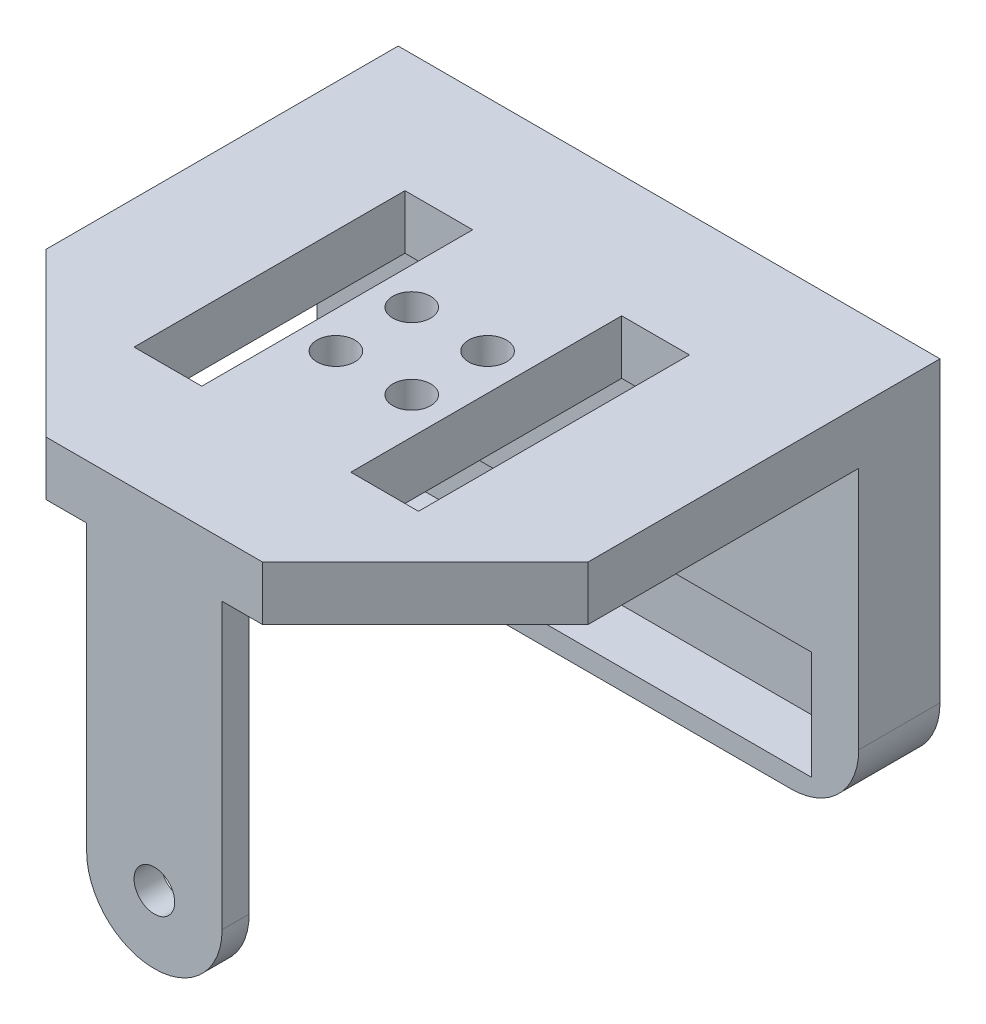
ISO-10303-21;
HEADER;
FILE_DESCRIPTION(('STEP AP214'),'2;1');
FILE_NAME('part.step','',(''),(''),'','','');
FILE_SCHEMA(('AUTOMOTIVE_DESIGN { 1 0 10303 214 1 1 1 1 }'));
ENDSEC;
DATA;
#1=APPLICATION_CONTEXT('core data for automotive mechanical design processes');
#2=APPLICATION_PROTOCOL_DEFINITION('international standard','automotive_design',2000,#1);
#3=PRODUCT_CONTEXT('',#1,'mechanical');
#4=PRODUCT('Part','Part','',(#3));
#5=PRODUCT_RELATED_PRODUCT_CATEGORY('part','',(#4));
#6=PRODUCT_DEFINITION_FORMATION('','',#4);
#7=PRODUCT_DEFINITION_CONTEXT('part definition',#1,'design');
#8=PRODUCT_DEFINITION('design','',#6,#7);
#9=PRODUCT_DEFINITION_SHAPE('','',#8);
#10=(LENGTH_UNIT() NAMED_UNIT(*) SI_UNIT(.MILLI.,.METRE.));
#11=(NAMED_UNIT(*) PLANE_ANGLE_UNIT() SI_UNIT($,.RADIAN.));
#12=(NAMED_UNIT(*) SI_UNIT($,.STERADIAN.) SOLID_ANGLE_UNIT());
#13=UNCERTAINTY_MEASURE_WITH_UNIT(LENGTH_MEASURE(1.E-05),#10,'distance_accuracy_value','');
#14=(GEOMETRIC_REPRESENTATION_CONTEXT(3) GLOBAL_UNCERTAINTY_ASSIGNED_CONTEXT((#13)) GLOBAL_UNIT_ASSIGNED_CONTEXT((#10,
#11,#12)) REPRESENTATION_CONTEXT('',''));
#15=CARTESIAN_POINT('',(0.,0.,0.));
#16=DIRECTION('',(0.,0.,1.));
#17=DIRECTION('',(1.,0.,0.));
#18=AXIS2_PLACEMENT_3D('',#15,#16,#17);
#19=CARTESIAN_POINT('',(-20.,9.5,38.));
#20=DIRECTION('',(0.,1.,0.));
#21=DIRECTION('',(0.,0.,1.));
#22=AXIS2_PLACEMENT_3D('',#19,#20,#21);
#23=PLANE('',#22);
#24=DIRECTION('',(1.,0.,0.));
#25=VECTOR('',#24,1.);
#26=CARTESIAN_POINT('',(-20.,9.5,29.));
#27=LINE('',#26,#25);
#28=CARTESIAN_POINT('',(-10.5,9.49999999999999,29.));
#29=VERTEX_POINT('',#28);
#30=CARTESIAN_POINT('',(-5.5,9.49999999999999,29.));
#31=VERTEX_POINT('',#30);
#32=EDGE_CURVE('E376',#29,#31,#27,.T.);
#33=ORIENTED_EDGE('',*,*,#32,.T.);
#34=DIRECTION('',(0.,0.,-1.));
#35=VECTOR('',#34,1.);
#36=CARTESIAN_POINT('',(-5.5,9.5,38.));
#37=LINE('',#36,#35);
#38=CARTESIAN_POINT('',(-5.5,9.49999999999999,9.));
#39=VERTEX_POINT('',#38);
#40=EDGE_CURVE('E373',#31,#39,#37,.T.);
#41=ORIENTED_EDGE('',*,*,#40,.T.);
#42=DIRECTION('',(-1.,0.,0.));
#43=VECTOR('',#42,1.);
#44=CARTESIAN_POINT('',(-20.,9.5,9.));
#45=LINE('',#44,#43);
#46=CARTESIAN_POINT('',(-10.5,9.5,9.));
#47=VERTEX_POINT('',#46);
#48=EDGE_CURVE('E382',#39,#47,#45,.T.);
#49=ORIENTED_EDGE('',*,*,#48,.T.);
#50=DIRECTION('',(0.,0.,1.));
#51=VECTOR('',#50,1.);
#52=CARTESIAN_POINT('',(-10.5,9.5,38.));
#53=LINE('',#52,#51);
#54=EDGE_CURVE('E379',#47,#29,#53,.T.);
#55=ORIENTED_EDGE('',*,*,#54,.T.);
#56=EDGE_LOOP('',(#33,#41,#49,#55));
#57=FACE_BOUND('',#56,.T.);
#58=CARTESIAN_POINT('',(2.8,9.49999999999999,16.2));
#59=DIRECTION('',(0.,1.,0.));
#60=DIRECTION('',(0.,0.,1.));
#61=AXIS2_PLACEMENT_3D('',#58,#59,#60);
#62=CIRCLE('',#61,1.4);
#63=CARTESIAN_POINT('',(2.8,9.49999999999999,17.6));
#64=VERTEX_POINT('',#63);
#65=EDGE_CURVE('E385',#64,#64,#62,.T.);
#66=ORIENTED_EDGE('',*,*,#65,.T.);
#67=EDGE_LOOP('',(#66));
#68=FACE_BOUND('',#67,.T.);
#69=CARTESIAN_POINT('',(2.8,9.49999999999999,21.8));
#70=DIRECTION('',(0.,1.,0.));
#71=DIRECTION('',(0.,0.,1.));
#72=AXIS2_PLACEMENT_3D('',#69,#70,#71);
#73=CIRCLE('',#72,1.4);
#74=CARTESIAN_POINT('',(2.8,9.49999999999999,23.2));
#75=VERTEX_POINT('',#74);
#76=EDGE_CURVE('E388',#75,#75,#73,.T.);
#77=ORIENTED_EDGE('',*,*,#76,.T.);
#78=EDGE_LOOP('',(#77));
#79=FACE_BOUND('',#78,.T.);
#80=CARTESIAN_POINT('',(-2.8,9.49999999999999,21.8));
#81=DIRECTION('',(0.,1.,0.));
#82=DIRECTION('',(0.,0.,1.));
#83=AXIS2_PLACEMENT_3D('',#80,#81,#82);
#84=CIRCLE('',#83,1.4);
#85=CARTESIAN_POINT('',(-2.8,9.49999999999999,23.2));
#86=VERTEX_POINT('',#85);
#87=EDGE_CURVE('E391',#86,#86,#84,.T.);
#88=ORIENTED_EDGE('',*,*,#87,.T.);
#89=EDGE_LOOP('',(#88));
#90=FACE_BOUND('',#89,.T.);
#91=DIRECTION('',(1.,0.,0.));
#92=VECTOR('',#91,1.);
#93=CARTESIAN_POINT('',(-20.,9.5,29.));
#94=LINE('',#93,#92);
#95=CARTESIAN_POINT('',(5.50000000000001,9.49999999999999,29.));
#96=VERTEX_POINT('',#95);
#97=CARTESIAN_POINT('',(10.5,9.49999999999999,29.));
#98=VERTEX_POINT('',#97);
#99=EDGE_CURVE('E397',#96,#98,#94,.T.);
#100=ORIENTED_EDGE('',*,*,#99,.T.);
#101=DIRECTION('',(0.,0.,-1.));
#102=VECTOR('',#101,1.);
#103=CARTESIAN_POINT('',(10.5,9.5,38.));
#104=LINE('',#103,#102);
#105=CARTESIAN_POINT('',(10.5,9.49999999999999,9.));
#106=VERTEX_POINT('',#105);
#107=EDGE_CURVE('E394',#98,#106,#104,.T.);
#108=ORIENTED_EDGE('',*,*,#107,.T.);
#109=DIRECTION('',(-1.,0.,0.));
#110=VECTOR('',#109,1.);
#111=CARTESIAN_POINT('',(-20.,9.5,9.));
#112=LINE('',#111,#110);
#113=CARTESIAN_POINT('',(5.5,9.5,9.));
#114=VERTEX_POINT('',#113);
#115=EDGE_CURVE('E403',#106,#114,#112,.T.);
#116=ORIENTED_EDGE('',*,*,#115,.T.);
#117=DIRECTION('',(0.,0.,1.));
#118=VECTOR('',#117,1.);
#119=CARTESIAN_POINT('',(5.50000000000001,9.5,38.));
#120=LINE('',#119,#118);
#121=EDGE_CURVE('E400',#114,#96,#120,.T.);
#122=ORIENTED_EDGE('',*,*,#121,.T.);
#123=EDGE_LOOP('',(#100,#108,#116,#122));
#124=FACE_BOUND('',#123,.T.);
#125=CARTESIAN_POINT('',(-2.8,9.49999999999999,16.2));
#126=DIRECTION('',(0.,1.,0.));
#127=DIRECTION('',(0.,0.,1.));
#128=AXIS2_PLACEMENT_3D('',#125,#126,#127);
#129=CIRCLE('',#128,1.4);
#130=CARTESIAN_POINT('',(-2.8,9.49999999999999,17.6));
#131=VERTEX_POINT('',#130);
#132=EDGE_CURVE('E406',#131,#131,#129,.T.);
#133=ORIENTED_EDGE('',*,*,#132,.T.);
#134=EDGE_LOOP('',(#133));
#135=FACE_BOUND('',#134,.T.);
#136=DIRECTION('',(0.,0.,-1.));
#137=VECTOR('',#136,1.);
#138=CARTESIAN_POINT('',(20.,9.5,38.));
#139=LINE('',#138,#137);
#140=CARTESIAN_POINT('',(20.,9.49999999999999,26.));
#141=VERTEX_POINT('',#140);
#142=CARTESIAN_POINT('',(20.,9.5,6.));
#143=VERTEX_POINT('',#142);
#144=EDGE_CURVE('E289',#141,#143,#139,.T.);
#145=ORIENTED_EDGE('',*,*,#144,.F.);
#146=DIRECTION('',(-0.707106781186548,0.,0.707106781186548));
#147=VECTOR('',#146,1.);
#148=CARTESIAN_POINT('',(-6.,9.5,52.));
#149=LINE('',#148,#147);
#150=CARTESIAN_POINT('',(8.00000000000001,9.49999999999999,38.));
#151=VERTEX_POINT('',#150);
#152=EDGE_CURVE('E223',#141,#151,#149,.T.);
#153=ORIENTED_EDGE('',*,*,#152,.T.);
#154=DIRECTION('',(1.,0.,0.));
#155=VECTOR('',#154,1.);
#156=CARTESIAN_POINT('',(-20.,9.5,38.));
#157=LINE('',#156,#155);
#158=CARTESIAN_POINT('',(5.,9.5,38.));
#159=VERTEX_POINT('',#158);
#160=EDGE_CURVE('E351',#159,#151,#157,.T.);
#161=ORIENTED_EDGE('',*,*,#160,.F.);
#162=DIRECTION('',(0.,0.,1.));
#163=VECTOR('',#162,1.);
#164=CARTESIAN_POINT('',(5.,9.5,38.));
#165=LINE('',#164,#163);
#166=CARTESIAN_POINT('',(5.,9.5,36.));
#167=VERTEX_POINT('',#166);
#168=EDGE_CURVE('E364',#167,#159,#165,.T.);
#169=ORIENTED_EDGE('',*,*,#168,.F.);
#170=DIRECTION('',(1.,0.,0.));
#171=VECTOR('',#170,1.);
#172=CARTESIAN_POINT('',(-5.,9.5,36.));
#173=LINE('',#172,#171);
#174=CARTESIAN_POINT('',(-5.,9.5,36.));
#175=VERTEX_POINT('',#174);
#176=EDGE_CURVE('E367',#175,#167,#173,.T.);
#177=ORIENTED_EDGE('',*,*,#176,.F.);
#178=DIRECTION('',(0.,0.,-1.));
#179=VECTOR('',#178,1.);
#180=CARTESIAN_POINT('',(-5.,9.5,38.));
#181=LINE('',#180,#179);
#182=CARTESIAN_POINT('',(-5.,9.5,38.));
#183=VERTEX_POINT('',#182);
#184=EDGE_CURVE('E370',#183,#175,#181,.T.);
#185=ORIENTED_EDGE('',*,*,#184,.F.);
#186=CARTESIAN_POINT('',(-7.99999999999999,9.5,38.));
#187=VERTEX_POINT('',#186);
#188=EDGE_CURVE('E354',#187,#183,#157,.T.);
#189=ORIENTED_EDGE('',*,*,#188,.F.);
#190=DIRECTION('',(-0.707106781186548,0.,-0.707106781186547));
#191=VECTOR('',#190,1.);
#192=CARTESIAN_POINT('',(-14.,9.5,32.));
#193=LINE('',#192,#191);
#194=CARTESIAN_POINT('',(-20.,9.49999999999999,26.));
#195=VERTEX_POINT('',#194);
#196=EDGE_CURVE('E410',#187,#195,#193,.T.);
#197=ORIENTED_EDGE('',*,*,#196,.T.);
#198=DIRECTION('',(0.,0.,-1.));
#199=VECTOR('',#198,1.);
#200=CARTESIAN_POINT('',(-20.,9.5,38.));
#201=LINE('',#200,#199);
#202=CARTESIAN_POINT('',(-20.,9.5,6.));
#203=VERTEX_POINT('',#202);
#204=EDGE_CURVE('E347',#195,#203,#201,.T.);
#205=ORIENTED_EDGE('',*,*,#204,.T.);
#206=DIRECTION('',(1.,0.,0.));
#207=VECTOR('',#206,1.);
#208=CARTESIAN_POINT('',(-20.,9.5,6.));
#209=LINE('',#208,#207);
#210=EDGE_CURVE('E349',#203,#143,#209,.T.);
#211=ORIENTED_EDGE('',*,*,#210,.T.);
#212=EDGE_LOOP('',(#145,#153,#161,#169,#177,#185,#189,#197,#205,#211));
#213=FACE_BOUND('',#212,.T.);
#214=ADVANCED_FACE('F36',(#57,#68,#79,#90,#124,#135,#213),#23,.F.);
#215=CARTESIAN_POINT('',(0.,0.,6.));
#216=DIRECTION('',(0.,0.,-1.));
#217=DIRECTION('',(-1.,0.,0.));
#218=AXIS2_PLACEMENT_3D('',#215,#216,#217);
#219=PLANE('',#218);
#220=DIRECTION('',(-1.,0.,0.));
#221=VECTOR('',#220,1.);
#222=CARTESIAN_POINT('',(-16.5,-4.,6.));
#223=LINE('',#222,#221);
#224=CARTESIAN_POINT('',(16.5,-4.,6.));
#225=VERTEX_POINT('',#224);
#226=CARTESIAN_POINT('',(-16.5,-4.,6.));
#227=VERTEX_POINT('',#226);
#228=EDGE_CURVE('E325',#225,#227,#223,.T.);
#229=ORIENTED_EDGE('',*,*,#228,.F.);
#230=DIRECTION('',(0.,1.,0.));
#231=VECTOR('',#230,1.);
#232=CARTESIAN_POINT('',(16.5,-4.,6.));
#233=LINE('',#232,#231);
#234=CARTESIAN_POINT('',(16.5,-12.,6.));
#235=VERTEX_POINT('',#234);
#236=EDGE_CURVE('E328',#235,#225,#233,.T.);
#237=ORIENTED_EDGE('',*,*,#236,.F.);
#238=DIRECTION('',(1.,0.,0.));
#239=VECTOR('',#238,1.);
#240=CARTESIAN_POINT('',(-16.5,-12.,6.));
#241=LINE('',#240,#239);
#242=CARTESIAN_POINT('',(-16.5,-12.,6.));
#243=VERTEX_POINT('',#242);
#244=EDGE_CURVE('E318',#243,#235,#241,.T.);
#245=ORIENTED_EDGE('',*,*,#244,.F.);
#246=DIRECTION('',(0.,-1.,0.));
#247=VECTOR('',#246,1.);
#248=CARTESIAN_POINT('',(-16.5,-4.,6.));
#249=LINE('',#248,#247);
#250=EDGE_CURVE('E322',#227,#243,#249,.T.);
#251=ORIENTED_EDGE('',*,*,#250,.F.);
#252=EDGE_LOOP('',(#229,#237,#245,#251));
#253=FACE_BOUND('',#252,.T.);
#254=DIRECTION('',(1.,0.,0.));
#255=VECTOR('',#254,1.);
#256=CARTESIAN_POINT('',(-20.,-13.5,6.));
#257=LINE('',#256,#255);
#258=CARTESIAN_POINT('',(-15.,-13.5,6.));
#259=VERTEX_POINT('',#258);
#260=CARTESIAN_POINT('',(15.,-13.5,6.));
#261=VERTEX_POINT('',#260);
#262=EDGE_CURVE('E252',#259,#261,#257,.T.);
#263=ORIENTED_EDGE('',*,*,#262,.T.);
#264=CARTESIAN_POINT('',(15.,-8.5,6.));
#265=DIRECTION('',(0.,0.,-1.));
#266=DIRECTION('',(-1.,0.,0.));
#267=AXIS2_PLACEMENT_3D('',#264,#265,#266);
#268=CIRCLE('',#267,5.);
#269=CARTESIAN_POINT('',(20.,-8.5,6.));
#270=VERTEX_POINT('',#269);
#271=EDGE_CURVE('E45',#261,#270,#268,.F.);
#272=ORIENTED_EDGE('',*,*,#271,.T.);
#273=DIRECTION('',(0.,1.,0.));
#274=VECTOR('',#273,1.);
#275=CARTESIAN_POINT('',(20.,-13.5,6.));
#276=LINE('',#275,#274);
#277=EDGE_CURVE('E286',#270,#143,#276,.T.);
#278=ORIENTED_EDGE('',*,*,#277,.T.);
#279=ORIENTED_EDGE('',*,*,#210,.F.);
#280=DIRECTION('',(0.,-1.,0.));
#281=VECTOR('',#280,1.);
#282=CARTESIAN_POINT('',(-20.,-13.5,6.));
#283=LINE('',#282,#281);
#284=CARTESIAN_POINT('',(-20.,-8.5,6.));
#285=VERTEX_POINT('',#284);
#286=EDGE_CURVE('E291',#203,#285,#283,.T.);
#287=ORIENTED_EDGE('',*,*,#286,.T.);
#288=CARTESIAN_POINT('',(-15.,-8.5,6.));
#289=DIRECTION('',(0.,0.,-1.));
#290=DIRECTION('',(-1.,0.,0.));
#291=AXIS2_PLACEMENT_3D('',#288,#289,#290);
#292=CIRCLE('',#291,5.);
#293=EDGE_CURVE('E280',#285,#259,#292,.F.);
#294=ORIENTED_EDGE('',*,*,#293,.T.);
#295=EDGE_LOOP('',(#263,#272,#278,#279,#287,#294));
#296=FACE_BOUND('',#295,.T.);
#297=ADVANCED_FACE('F284',(#253,#296),#219,.F.);
#298=CARTESIAN_POINT('',(20.,-13.5,6.));
#299=DIRECTION('',(-1.,0.,0.));
#300=DIRECTION('',(0.,0.,1.));
#301=AXIS2_PLACEMENT_3D('',#298,#299,#300);
#302=PLANE('',#301);
#303=ORIENTED_EDGE('',*,*,#277,.F.);
#304=DIRECTION('',(0.,0.,-1.));
#305=VECTOR('',#304,1.);
#306=CARTESIAN_POINT('',(20.,-8.5,6.));
#307=LINE('',#306,#305);
#308=CARTESIAN_POINT('',(20.,-8.5,0.));
#309=VERTEX_POINT('',#308);
#310=EDGE_CURVE('E270',#270,#309,#307,.T.);
#311=ORIENTED_EDGE('',*,*,#310,.T.);
#312=DIRECTION('',(0.,1.,0.));
#313=VECTOR('',#312,1.);
#314=CARTESIAN_POINT('',(20.,-13.5,0.));
#315=LINE('',#314,#313);
#316=CARTESIAN_POINT('',(20.,13.5,0.));
#317=VERTEX_POINT('',#316);
#318=EDGE_CURVE('E245',#309,#317,#315,.T.);
#319=ORIENTED_EDGE('',*,*,#318,.T.);
#320=DIRECTION('',(0.,0.,-1.));
#321=VECTOR('',#320,1.);
#322=CARTESIAN_POINT('',(20.,13.5,6.));
#323=LINE('',#322,#321);
#324=CARTESIAN_POINT('',(20.,13.5,26.));
#325=VERTEX_POINT('',#324);
#326=EDGE_CURVE('E235',#325,#317,#323,.T.);
#327=ORIENTED_EDGE('',*,*,#326,.F.);
#328=DIRECTION('',(0.,1.,0.));
#329=VECTOR('',#328,1.);
#330=CARTESIAN_POINT('',(20.,-16.5,26.));
#331=LINE('',#330,#329);
#332=EDGE_CURVE('E217',#141,#325,#331,.T.);
#333=ORIENTED_EDGE('',*,*,#332,.F.);
#334=ORIENTED_EDGE('',*,*,#144,.T.);
#335=EDGE_LOOP('',(#303,#311,#319,#327,#333,#334));
#336=FACE_BOUND('',#335,.T.);
#337=ADVANCED_FACE('F242',(#336),#302,.F.);
#338=CARTESIAN_POINT('',(-20.,13.5,6.));
#339=DIRECTION('',(0.,-1.,0.));
#340=DIRECTION('',(0.,0.,-1.));
#341=AXIS2_PLACEMENT_3D('',#338,#339,#340);
#342=PLANE('',#341);
#343=DIRECTION('',(-1.,0.,0.));
#344=VECTOR('',#343,1.);
#345=CARTESIAN_POINT('',(-10.5,13.5,9.));
#346=LINE('',#345,#344);
#347=CARTESIAN_POINT('',(-5.5,13.5,9.));
#348=VERTEX_POINT('',#347);
#349=CARTESIAN_POINT('',(-10.5,13.5,9.));
#350=VERTEX_POINT('',#349);
#351=EDGE_CURVE('E438',#348,#350,#346,.T.);
#352=ORIENTED_EDGE('',*,*,#351,.F.);
#353=DIRECTION('',(0.,0.,-1.));
#354=VECTOR('',#353,1.);
#355=CARTESIAN_POINT('',(-5.5,13.5,29.));
#356=LINE('',#355,#354);
#357=CARTESIAN_POINT('',(-5.5,13.5,29.));
#358=VERTEX_POINT('',#357);
#359=EDGE_CURVE('E441',#358,#348,#356,.T.);
#360=ORIENTED_EDGE('',*,*,#359,.F.);
#361=DIRECTION('',(1.,0.,0.));
#362=VECTOR('',#361,1.);
#363=CARTESIAN_POINT('',(-10.5,13.5,29.));
#364=LINE('',#363,#362);
#365=CARTESIAN_POINT('',(-10.5,13.5,29.));
#366=VERTEX_POINT('',#365);
#367=EDGE_CURVE('E427',#366,#358,#364,.T.);
#368=ORIENTED_EDGE('',*,*,#367,.F.);
#369=DIRECTION('',(0.,0.,1.));
#370=VECTOR('',#369,1.);
#371=CARTESIAN_POINT('',(-10.5,13.5,29.));
#372=LINE('',#371,#370);
#373=EDGE_CURVE('E435',#350,#366,#372,.T.);
#374=ORIENTED_EDGE('',*,*,#373,.F.);
#375=EDGE_LOOP('',(#352,#360,#368,#374));
#376=FACE_BOUND('',#375,.T.);
#377=CARTESIAN_POINT('',(2.8,13.5,16.2));
#378=DIRECTION('',(0.,1.,0.));
#379=DIRECTION('',(0.,0.,-1.));
#380=AXIS2_PLACEMENT_3D('',#377,#378,#379);
#381=CIRCLE('',#380,1.4);
#382=CARTESIAN_POINT('',(2.8,13.5,14.8));
#383=VERTEX_POINT('',#382);
#384=EDGE_CURVE('E420',#383,#383,#381,.T.);
#385=ORIENTED_EDGE('',*,*,#384,.F.);
#386=EDGE_LOOP('',(#385));
#387=FACE_BOUND('',#386,.T.);
#388=CARTESIAN_POINT('',(2.8,13.5,21.8));
#389=DIRECTION('',(0.,1.,0.));
#390=DIRECTION('',(0.,0.,1.));
#391=AXIS2_PLACEMENT_3D('',#388,#389,#390);
#392=CIRCLE('',#391,1.4);
#393=CARTESIAN_POINT('',(2.8,13.5,23.2));
#394=VERTEX_POINT('',#393);
#395=EDGE_CURVE('E417',#394,#394,#392,.T.);
#396=ORIENTED_EDGE('',*,*,#395,.F.);
#397=EDGE_LOOP('',(#396));
#398=FACE_BOUND('',#397,.T.);
#399=CARTESIAN_POINT('',(-2.8,13.5,21.8));
#400=DIRECTION('',(0.,1.,0.));
#401=DIRECTION('',(0.,0.,-1.));
#402=AXIS2_PLACEMENT_3D('',#399,#400,#401);
#403=CIRCLE('',#402,1.4);
#404=CARTESIAN_POINT('',(-2.8,13.5,20.4));
#405=VERTEX_POINT('',#404);
#406=EDGE_CURVE('E416',#405,#405,#403,.T.);
#407=ORIENTED_EDGE('',*,*,#406,.F.);
#408=EDGE_LOOP('',(#407));
#409=FACE_BOUND('',#408,.T.);
#410=DIRECTION('',(-1.,0.,0.));
#411=VECTOR('',#410,1.);
#412=CARTESIAN_POINT('',(10.5,13.5,9.));
#413=LINE('',#412,#411);
#414=CARTESIAN_POINT('',(10.5,13.5,9.));
#415=VERTEX_POINT('',#414);
#416=CARTESIAN_POINT('',(5.5,13.5,9.));
#417=VERTEX_POINT('',#416);
#418=EDGE_CURVE('E465',#415,#417,#413,.T.);
#419=ORIENTED_EDGE('',*,*,#418,.F.);
#420=DIRECTION('',(0.,0.,-1.));
#421=VECTOR('',#420,1.);
#422=CARTESIAN_POINT('',(10.5,13.5,29.));
#423=LINE('',#422,#421);
#424=CARTESIAN_POINT('',(10.5,13.5,29.));
#425=VERTEX_POINT('',#424);
#426=EDGE_CURVE('E449',#425,#415,#423,.T.);
#427=ORIENTED_EDGE('',*,*,#426,.F.);
#428=DIRECTION('',(1.,0.,0.));
#429=VECTOR('',#428,1.);
#430=CARTESIAN_POINT('',(10.5,13.5,29.));
#431=LINE('',#430,#429);
#432=CARTESIAN_POINT('',(5.50000000000001,13.5,29.));
#433=VERTEX_POINT('',#432);
#434=EDGE_CURVE('E455',#433,#425,#431,.T.);
#435=ORIENTED_EDGE('',*,*,#434,.F.);
#436=DIRECTION('',(0.,0.,1.));
#437=VECTOR('',#436,1.);
#438=CARTESIAN_POINT('',(5.50000000000001,13.5,29.));
#439=LINE('',#438,#437);
#440=EDGE_CURVE('E462',#417,#433,#439,.T.);
#441=ORIENTED_EDGE('',*,*,#440,.F.);
#442=EDGE_LOOP('',(#419,#427,#435,#441));
#443=FACE_BOUND('',#442,.T.);
#444=CARTESIAN_POINT('',(-2.8,13.5,16.2));
#445=DIRECTION('',(0.,1.,0.));
#446=DIRECTION('',(0.,0.,1.));
#447=AXIS2_PLACEMENT_3D('',#444,#445,#446);
#448=CIRCLE('',#447,1.4);
#449=CARTESIAN_POINT('',(-2.8,13.5,17.6));
#450=VERTEX_POINT('',#449);
#451=EDGE_CURVE('E413',#450,#450,#448,.T.);
#452=ORIENTED_EDGE('',*,*,#451,.F.);
#453=EDGE_LOOP('',(#452));
#454=FACE_BOUND('',#453,.T.);
#455=DIRECTION('',(1.,0.,0.));
#456=VECTOR('',#455,1.);
#457=CARTESIAN_POINT('',(-20.,13.5,38.));
#458=LINE('',#457,#456);
#459=CARTESIAN_POINT('',(-8.,13.5,38.));
#460=VERTEX_POINT('',#459);
#461=CARTESIAN_POINT('',(8.00000000000001,13.5,38.));
#462=VERTEX_POINT('',#461);
#463=EDGE_CURVE('E239',#460,#462,#458,.T.);
#464=ORIENTED_EDGE('',*,*,#463,.T.);
#465=DIRECTION('',(-0.707106781186547,0.,0.707106781186547));
#466=VECTOR('',#465,1.);
#467=CARTESIAN_POINT('',(20.,13.5,26.));
#468=LINE('',#467,#466);
#469=EDGE_CURVE('E220',#325,#462,#468,.T.);
#470=ORIENTED_EDGE('',*,*,#469,.F.);
#471=ORIENTED_EDGE('',*,*,#326,.T.);
#472=DIRECTION('',(-1.,0.,0.));
#473=VECTOR('',#472,1.);
#474=CARTESIAN_POINT('',(-20.,13.5,0.));
#475=LINE('',#474,#473);
#476=CARTESIAN_POINT('',(-20.,13.5,0.));
#477=VERTEX_POINT('',#476);
#478=EDGE_CURVE('E301',#317,#477,#475,.T.);
#479=ORIENTED_EDGE('',*,*,#478,.T.);
#480=DIRECTION('',(0.,0.,-1.));
#481=VECTOR('',#480,1.);
#482=CARTESIAN_POINT('',(-20.,13.5,6.));
#483=LINE('',#482,#481);
#484=CARTESIAN_POINT('',(-20.,13.5,26.));
#485=VERTEX_POINT('',#484);
#486=EDGE_CURVE('E247',#485,#477,#483,.T.);
#487=ORIENTED_EDGE('',*,*,#486,.F.);
#488=DIRECTION('',(-0.707106781186548,0.,-0.707106781186547));
#489=VECTOR('',#488,1.);
#490=CARTESIAN_POINT('',(-20.,13.5,26.));
#491=LINE('',#490,#489);
#492=EDGE_CURVE('E228',#460,#485,#491,.T.);
#493=ORIENTED_EDGE('',*,*,#492,.F.);
#494=EDGE_LOOP('',(#464,#470,#471,#479,#487,#493));
#495=FACE_BOUND('',#494,.T.);
#496=ADVANCED_FACE('F233',(#376,#387,#398,#409,#443,#454,#495),#342,.F.);
#497=CARTESIAN_POINT('',(-20.,-13.5,6.));
#498=DIRECTION('',(1.,0.,0.));
#499=DIRECTION('',(0.,0.,-1.));
#500=AXIS2_PLACEMENT_3D('',#497,#498,#499);
#501=PLANE('',#500);
#502=DIRECTION('',(0.,-1.,0.));
#503=VECTOR('',#502,1.);
#504=CARTESIAN_POINT('',(-20.,-13.5,0.));
#505=LINE('',#504,#503);
#506=CARTESIAN_POINT('',(-20.,-8.5,0.));
#507=VERTEX_POINT('',#506);
#508=EDGE_CURVE('E300',#477,#507,#505,.T.);
#509=ORIENTED_EDGE('',*,*,#508,.T.);
#510=DIRECTION('',(0.,0.,-1.));
#511=VECTOR('',#510,1.);
#512=CARTESIAN_POINT('',(-20.,-8.5,6.));
#513=LINE('',#512,#511);
#514=EDGE_CURVE('E11',#507,#285,#513,.F.);
#515=ORIENTED_EDGE('',*,*,#514,.T.);
#516=ORIENTED_EDGE('',*,*,#286,.F.);
#517=ORIENTED_EDGE('',*,*,#204,.F.);
#518=DIRECTION('',(0.,1.,0.));
#519=VECTOR('',#518,1.);
#520=CARTESIAN_POINT('',(-20.,-16.5,26.));
#521=LINE('',#520,#519);
#522=EDGE_CURVE('E446',#195,#485,#521,.T.);
#523=ORIENTED_EDGE('',*,*,#522,.T.);
#524=ORIENTED_EDGE('',*,*,#486,.T.);
#525=EDGE_LOOP('',(#509,#515,#516,#517,#523,#524));
#526=FACE_BOUND('',#525,.T.);
#527=ADVANCED_FACE('F513',(#526),#501,.F.);
#528=CARTESIAN_POINT('',(-20.,-13.5,6.));
#529=DIRECTION('',(0.,1.,0.));
#530=DIRECTION('',(0.,0.,1.));
#531=AXIS2_PLACEMENT_3D('',#528,#529,#530);
#532=PLANE('',#531);
#533=DIRECTION('',(1.,0.,0.));
#534=VECTOR('',#533,1.);
#535=CARTESIAN_POINT('',(-20.,-13.5,0.));
#536=LINE('',#535,#534);
#537=CARTESIAN_POINT('',(-15.,-13.5,0.));
#538=VERTEX_POINT('',#537);
#539=CARTESIAN_POINT('',(15.,-13.5,0.));
#540=VERTEX_POINT('',#539);
#541=EDGE_CURVE('E292',#538,#540,#536,.T.);
#542=ORIENTED_EDGE('',*,*,#541,.T.);
#543=DIRECTION('',(0.,0.,-1.));
#544=VECTOR('',#543,1.);
#545=CARTESIAN_POINT('',(15.,-13.5,6.));
#546=LINE('',#545,#544);
#547=EDGE_CURVE('E58',#540,#261,#546,.F.);
#548=ORIENTED_EDGE('',*,*,#547,.T.);
#549=ORIENTED_EDGE('',*,*,#262,.F.);
#550=DIRECTION('',(0.,0.,-1.));
#551=VECTOR('',#550,1.);
#552=CARTESIAN_POINT('',(-15.,-13.5,6.));
#553=LINE('',#552,#551);
#554=EDGE_CURVE('E276',#259,#538,#553,.T.);
#555=ORIENTED_EDGE('',*,*,#554,.T.);
#556=EDGE_LOOP('',(#542,#548,#549,#555));
#557=FACE_BOUND('',#556,.T.);
#558=ADVANCED_FACE('F298',(#557),#532,.F.);
#559=CARTESIAN_POINT('',(0.,0.,0.));
#560=DIRECTION('',(0.,0.,-1.));
#561=DIRECTION('',(-1.,0.,0.));
#562=AXIS2_PLACEMENT_3D('',#559,#560,#561);
#563=PLANE('',#562);
#564=CARTESIAN_POINT('',(0.,-8.,0.));
#565=DIRECTION('',(0.,0.,1.));
#566=DIRECTION('',(1.,0.,0.));
#567=AXIS2_PLACEMENT_3D('',#564,#565,#566);
#568=CIRCLE('',#567,1.05);
#569=CARTESIAN_POINT('',(1.05,-8.,0.));
#570=VERTEX_POINT('',#569);
#571=EDGE_CURVE('E330',#570,#570,#568,.T.);
#572=ORIENTED_EDGE('',*,*,#571,.T.);
#573=EDGE_LOOP('',(#572));
#574=FACE_BOUND('',#573,.T.);
#575=ORIENTED_EDGE('',*,*,#318,.F.);
#576=CARTESIAN_POINT('',(15.,-8.5,0.));
#577=DIRECTION('',(0.,0.,-1.));
#578=DIRECTION('',(-1.,0.,0.));
#579=AXIS2_PLACEMENT_3D('',#576,#577,#578);
#580=CIRCLE('',#579,5.);
#581=EDGE_CURVE('E274',#309,#540,#580,.T.);
#582=ORIENTED_EDGE('',*,*,#581,.T.);
#583=ORIENTED_EDGE('',*,*,#541,.F.);
#584=CARTESIAN_POINT('',(-15.,-8.5,0.));
#585=DIRECTION('',(0.,0.,-1.));
#586=DIRECTION('',(-1.,0.,0.));
#587=AXIS2_PLACEMENT_3D('',#584,#585,#586);
#588=CIRCLE('',#587,5.);
#589=EDGE_CURVE('E272',#538,#507,#588,.T.);
#590=ORIENTED_EDGE('',*,*,#589,.T.);
#591=ORIENTED_EDGE('',*,*,#508,.F.);
#592=ORIENTED_EDGE('',*,*,#478,.F.);
#593=EDGE_LOOP('',(#575,#582,#583,#590,#591,#592));
#594=FACE_BOUND('',#593,.T.);
#595=ADVANCED_FACE('F297',(#574,#594),#563,.T.);
#596=CARTESIAN_POINT('',(16.5,-4.,2.));
#597=DIRECTION('',(1.,0.,0.));
#598=DIRECTION('',(0.,0.,-1.));
#599=AXIS2_PLACEMENT_3D('',#596,#597,#598);
#600=PLANE('',#599);
#601=ORIENTED_EDGE('',*,*,#236,.T.);
#602=DIRECTION('',(0.,0.,1.));
#603=VECTOR('',#602,1.);
#604=CARTESIAN_POINT('',(16.5,-4.,2.));
#605=LINE('',#604,#603);
#606=CARTESIAN_POINT('',(16.5,-4.,2.));
#607=VERTEX_POINT('',#606);
#608=EDGE_CURVE('E309',#607,#225,#605,.T.);
#609=ORIENTED_EDGE('',*,*,#608,.F.);
#610=DIRECTION('',(0.,1.,0.));
#611=VECTOR('',#610,1.);
#612=CARTESIAN_POINT('',(16.5,-4.,2.));
#613=LINE('',#612,#611);
#614=CARTESIAN_POINT('',(16.5,-12.,2.));
#615=VERTEX_POINT('',#614);
#616=EDGE_CURVE('E321',#615,#607,#613,.T.);
#617=ORIENTED_EDGE('',*,*,#616,.F.);
#618=DIRECTION('',(0.,0.,1.));
#619=VECTOR('',#618,1.);
#620=CARTESIAN_POINT('',(16.5,-12.,2.));
#621=LINE('',#620,#619);
#622=EDGE_CURVE('E306',#615,#235,#621,.T.);
#623=ORIENTED_EDGE('',*,*,#622,.T.);
#624=EDGE_LOOP('',(#601,#609,#617,#623));
#625=FACE_BOUND('',#624,.T.);
#626=ADVANCED_FACE('F549',(#625),#600,.F.);
#627=CARTESIAN_POINT('',(-16.5,-12.,2.));
#628=DIRECTION('',(0.,-1.,0.));
#629=DIRECTION('',(0.,0.,-1.));
#630=AXIS2_PLACEMENT_3D('',#627,#628,#629);
#631=PLANE('',#630);
#632=ORIENTED_EDGE('',*,*,#244,.T.);
#633=ORIENTED_EDGE('',*,*,#622,.F.);
#634=DIRECTION('',(1.,0.,0.));
#635=VECTOR('',#634,1.);
#636=CARTESIAN_POINT('',(-16.5,-12.,2.));
#637=LINE('',#636,#635);
#638=CARTESIAN_POINT('',(-16.5,-12.,2.));
#639=VERTEX_POINT('',#638);
#640=EDGE_CURVE('E313',#639,#615,#637,.T.);
#641=ORIENTED_EDGE('',*,*,#640,.F.);
#642=DIRECTION('',(0.,0.,1.));
#643=VECTOR('',#642,1.);
#644=CARTESIAN_POINT('',(-16.5,-12.,2.));
#645=LINE('',#644,#643);
#646=EDGE_CURVE('E315',#639,#243,#645,.T.);
#647=ORIENTED_EDGE('',*,*,#646,.T.);
#648=EDGE_LOOP('',(#632,#633,#641,#647));
#649=FACE_BOUND('',#648,.T.);
#650=ADVANCED_FACE('F545',(#649),#631,.F.);
#651=CARTESIAN_POINT('',(-16.5,-4.,2.));
#652=DIRECTION('',(-1.,0.,0.));
#653=DIRECTION('',(0.,0.,1.));
#654=AXIS2_PLACEMENT_3D('',#651,#652,#653);
#655=PLANE('',#654);
#656=ORIENTED_EDGE('',*,*,#250,.T.);
#657=ORIENTED_EDGE('',*,*,#646,.F.);
#658=DIRECTION('',(0.,-1.,0.));
#659=VECTOR('',#658,1.);
#660=CARTESIAN_POINT('',(-16.5,-4.,2.));
#661=LINE('',#660,#659);
#662=CARTESIAN_POINT('',(-16.5,-4.,2.));
#663=VERTEX_POINT('',#662);
#664=EDGE_CURVE('E333',#663,#639,#661,.T.);
#665=ORIENTED_EDGE('',*,*,#664,.F.);
#666=DIRECTION('',(0.,0.,1.));
#667=VECTOR('',#666,1.);
#668=CARTESIAN_POINT('',(-16.5,-4.,2.));
#669=LINE('',#668,#667);
#670=EDGE_CURVE('E312',#663,#227,#669,.T.);
#671=ORIENTED_EDGE('',*,*,#670,.T.);
#672=EDGE_LOOP('',(#656,#657,#665,#671));
#673=FACE_BOUND('',#672,.T.);
#674=ADVANCED_FACE('F548',(#673),#655,.F.);
#675=CARTESIAN_POINT('',(-16.5,-4.,2.));
#676=DIRECTION('',(0.,1.,0.));
#677=DIRECTION('',(0.,0.,1.));
#678=AXIS2_PLACEMENT_3D('',#675,#676,#677);
#679=PLANE('',#678);
#680=ORIENTED_EDGE('',*,*,#228,.T.);
#681=ORIENTED_EDGE('',*,*,#670,.F.);
#682=DIRECTION('',(-1.,0.,0.));
#683=VECTOR('',#682,1.);
#684=CARTESIAN_POINT('',(-16.5,-4.,2.));
#685=LINE('',#684,#683);
#686=EDGE_CURVE('E336',#607,#663,#685,.T.);
#687=ORIENTED_EDGE('',*,*,#686,.F.);
#688=ORIENTED_EDGE('',*,*,#608,.T.);
#689=EDGE_LOOP('',(#680,#681,#687,#688));
#690=FACE_BOUND('',#689,.T.);
#691=ADVANCED_FACE('F543',(#690),#679,.F.);
#692=CARTESIAN_POINT('',(0.,0.,2.));
#693=DIRECTION('',(0.,0.,1.));
#694=DIRECTION('',(1.,0.,0.));
#695=AXIS2_PLACEMENT_3D('',#692,#693,#694);
#696=PLANE('',#695);
#697=CARTESIAN_POINT('',(0.,-8.,2.));
#698=DIRECTION('',(0.,0.,1.));
#699=DIRECTION('',(1.,0.,0.));
#700=AXIS2_PLACEMENT_3D('',#697,#698,#699);
#701=CIRCLE('',#700,1.05);
#702=CARTESIAN_POINT('',(1.05,-8.,2.));
#703=VERTEX_POINT('',#702);
#704=EDGE_CURVE('E341',#703,#703,#701,.T.);
#705=ORIENTED_EDGE('',*,*,#704,.F.);
#706=EDGE_LOOP('',(#705));
#707=FACE_BOUND('',#706,.T.);
#708=ORIENTED_EDGE('',*,*,#616,.T.);
#709=ORIENTED_EDGE('',*,*,#686,.T.);
#710=ORIENTED_EDGE('',*,*,#664,.T.);
#711=ORIENTED_EDGE('',*,*,#640,.T.);
#712=EDGE_LOOP('',(#708,#709,#710,#711));
#713=FACE_BOUND('',#712,.T.);
#714=ADVANCED_FACE('F539',(#707,#713),#696,.T.);
#715=CARTESIAN_POINT('',(0.,-8.,0.));
#716=DIRECTION('',(0.,0.,1.));
#717=DIRECTION('',(1.,0.,0.));
#718=AXIS2_PLACEMENT_3D('',#715,#716,#717);
#719=CYLINDRICAL_SURFACE('',#718,1.05);
#720=ORIENTED_EDGE('',*,*,#571,.F.);
#721=EDGE_LOOP('',(#720));
#722=FACE_BOUND('',#721,.T.);
#723=ORIENTED_EDGE('',*,*,#704,.T.);
#724=EDGE_LOOP('',(#723));
#725=FACE_BOUND('',#724,.T.);
#726=ADVANCED_FACE('F536',(#722,#725),#719,.F.);
#727=CARTESIAN_POINT('',(0.,0.,38.));
#728=DIRECTION('',(0.,0.,-1.));
#729=DIRECTION('',(-1.,0.,0.));
#730=AXIS2_PLACEMENT_3D('',#727,#728,#729);
#731=PLANE('',#730);
#732=CARTESIAN_POINT('',(0.,-11.5,38.));
#733=DIRECTION('',(0.,0.,-1.));
#734=DIRECTION('',(-1.,0.,0.));
#735=AXIS2_PLACEMENT_3D('',#732,#733,#734);
#736=CIRCLE('',#735,1.5);
#737=CARTESIAN_POINT('',(-1.5,-11.5,38.));
#738=VERTEX_POINT('',#737);
#739=EDGE_CURVE('E469',#738,#738,#736,.F.);
#740=ORIENTED_EDGE('',*,*,#739,.F.);
#741=EDGE_LOOP('',(#740));
#742=FACE_BOUND('',#741,.T.);
#743=DIRECTION('',(0.,1.,0.));
#744=VECTOR('',#743,1.);
#745=CARTESIAN_POINT('',(-5.,-16.5,38.));
#746=LINE('',#745,#744);
#747=CARTESIAN_POINT('',(-5.,-11.5,38.));
#748=VERTEX_POINT('',#747);
#749=EDGE_CURVE('E362',#748,#183,#746,.T.);
#750=ORIENTED_EDGE('',*,*,#749,.F.);
#751=CARTESIAN_POINT('',(0.,-11.5,38.));
#752=DIRECTION('',(0.,0.,-1.));
#753=DIRECTION('',(-1.,0.,0.));
#754=AXIS2_PLACEMENT_3D('',#751,#752,#753);
#755=CIRCLE('',#754,5.);
#756=CARTESIAN_POINT('',(0.,-16.5,38.));
#757=VERTEX_POINT('',#756);
#758=EDGE_CURVE('E266',#748,#757,#755,.F.);
#759=ORIENTED_EDGE('',*,*,#758,.T.);
#760=CARTESIAN_POINT('',(0.,-11.5,38.));
#761=DIRECTION('',(0.,0.,-1.));
#762=DIRECTION('',(-1.,0.,0.));
#763=AXIS2_PLACEMENT_3D('',#760,#761,#762);
#764=CIRCLE('',#763,5.);
#765=CARTESIAN_POINT('',(5.,-11.5,38.));
#766=VERTEX_POINT('',#765);
#767=EDGE_CURVE('E264',#757,#766,#764,.F.);
#768=ORIENTED_EDGE('',*,*,#767,.T.);
#769=DIRECTION('',(0.,1.,0.));
#770=VECTOR('',#769,1.);
#771=CARTESIAN_POINT('',(5.,-16.5,38.));
#772=LINE('',#771,#770);
#773=EDGE_CURVE('E360',#766,#159,#772,.T.);
#774=ORIENTED_EDGE('',*,*,#773,.T.);
#775=ORIENTED_EDGE('',*,*,#160,.T.);
#776=DIRECTION('',(0.,1.,0.));
#777=VECTOR('',#776,1.);
#778=CARTESIAN_POINT('',(8.00000000000001,0.,38.));
#779=LINE('',#778,#777);
#780=EDGE_CURVE('E250',#151,#462,#779,.T.);
#781=ORIENTED_EDGE('',*,*,#780,.T.);
#782=ORIENTED_EDGE('',*,*,#463,.F.);
#783=DIRECTION('',(0.,-1.,0.));
#784=VECTOR('',#783,1.);
#785=CARTESIAN_POINT('',(-7.99999999999999,0.,38.));
#786=LINE('',#785,#784);
#787=EDGE_CURVE('E246',#460,#187,#786,.T.);
#788=ORIENTED_EDGE('',*,*,#787,.T.);
#789=ORIENTED_EDGE('',*,*,#188,.T.);
#790=EDGE_LOOP('',(#750,#759,#768,#774,#775,#781,#782,#788,#789));
#791=FACE_BOUND('',#790,.T.);
#792=ADVANCED_FACE('F501',(#742,#791),#731,.F.);
#793=CARTESIAN_POINT('',(-5.,-16.5,38.));
#794=DIRECTION('',(1.,0.,0.));
#795=DIRECTION('',(0.,0.,-1.));
#796=AXIS2_PLACEMENT_3D('',#793,#794,#795);
#797=PLANE('',#796);
#798=DIRECTION('',(0.,1.,0.));
#799=VECTOR('',#798,1.);
#800=CARTESIAN_POINT('',(-5.,-16.5,36.));
#801=LINE('',#800,#799);
#802=CARTESIAN_POINT('',(-5.,-11.5,36.));
#803=VERTEX_POINT('',#802);
#804=EDGE_CURVE('E352',#803,#175,#801,.T.);
#805=ORIENTED_EDGE('',*,*,#804,.F.);
#806=DIRECTION('',(0.,0.,-1.));
#807=VECTOR('',#806,1.);
#808=CARTESIAN_POINT('',(-5.,-11.5,38.));
#809=LINE('',#808,#807);
#810=EDGE_CURVE('E261',#803,#748,#809,.F.);
#811=ORIENTED_EDGE('',*,*,#810,.T.);
#812=ORIENTED_EDGE('',*,*,#749,.T.);
#813=ORIENTED_EDGE('',*,*,#184,.T.);
#814=EDGE_LOOP('',(#805,#811,#812,#813));
#815=FACE_BOUND('',#814,.T.);
#816=ADVANCED_FACE('F483',(#815),#797,.F.);
#817=CARTESIAN_POINT('',(-5.,-16.5,36.));
#818=DIRECTION('',(0.,0.,1.));
#819=DIRECTION('',(1.,0.,0.));
#820=AXIS2_PLACEMENT_3D('',#817,#818,#819);
#821=PLANE('',#820);
#822=CARTESIAN_POINT('',(0.,-11.5,36.));
#823=DIRECTION('',(0.,0.,-1.));
#824=DIRECTION('',(-1.,0.,0.));
#825=AXIS2_PLACEMENT_3D('',#822,#823,#824);
#826=CIRCLE('',#825,1.5);
#827=CARTESIAN_POINT('',(-1.5,-11.5,36.));
#828=VERTEX_POINT('',#827);
#829=EDGE_CURVE('E472',#828,#828,#826,.T.);
#830=ORIENTED_EDGE('',*,*,#829,.F.);
#831=EDGE_LOOP('',(#830));
#832=FACE_BOUND('',#831,.T.);
#833=CARTESIAN_POINT('',(0.,-11.5,36.));
#834=DIRECTION('',(0.,0.,1.));
#835=DIRECTION('',(1.,0.,0.));
#836=AXIS2_PLACEMENT_3D('',#833,#834,#835);
#837=CIRCLE('',#836,5.);
#838=CARTESIAN_POINT('',(5.,-11.5,36.));
#839=VERTEX_POINT('',#838);
#840=CARTESIAN_POINT('',(0.,-16.5,36.));
#841=VERTEX_POINT('',#840);
#842=EDGE_CURVE('E257',#839,#841,#837,.F.);
#843=ORIENTED_EDGE('',*,*,#842,.T.);
#844=CARTESIAN_POINT('',(0.,-11.5,36.));
#845=DIRECTION('',(0.,0.,1.));
#846=DIRECTION('',(1.,0.,0.));
#847=AXIS2_PLACEMENT_3D('',#844,#845,#846);
#848=CIRCLE('',#847,5.);
#849=EDGE_CURVE('E259',#841,#803,#848,.F.);
#850=ORIENTED_EDGE('',*,*,#849,.T.);
#851=ORIENTED_EDGE('',*,*,#804,.T.);
#852=ORIENTED_EDGE('',*,*,#176,.T.);
#853=DIRECTION('',(0.,1.,0.));
#854=VECTOR('',#853,1.);
#855=CARTESIAN_POINT('',(5.,-16.5,36.));
#856=LINE('',#855,#854);
#857=EDGE_CURVE('E358',#839,#167,#856,.T.);
#858=ORIENTED_EDGE('',*,*,#857,.F.);
#859=EDGE_LOOP('',(#843,#850,#851,#852,#858));
#860=FACE_BOUND('',#859,.T.);
#861=ADVANCED_FACE('F479',(#832,#860),#821,.F.);
#862=CARTESIAN_POINT('',(5.,-16.5,38.));
#863=DIRECTION('',(-1.,0.,0.));
#864=DIRECTION('',(0.,0.,1.));
#865=AXIS2_PLACEMENT_3D('',#862,#863,#864);
#866=PLANE('',#865);
#867=ORIENTED_EDGE('',*,*,#773,.F.);
#868=DIRECTION('',(0.,0.,1.));
#869=VECTOR('',#868,1.);
#870=CARTESIAN_POINT('',(5.,-11.5,36.));
#871=LINE('',#870,#869);
#872=EDGE_CURVE('E268',#766,#839,#871,.F.);
#873=ORIENTED_EDGE('',*,*,#872,.T.);
#874=ORIENTED_EDGE('',*,*,#857,.T.);
#875=ORIENTED_EDGE('',*,*,#168,.T.);
#876=EDGE_LOOP('',(#867,#873,#874,#875));
#877=FACE_BOUND('',#876,.T.);
#878=ADVANCED_FACE('F482',(#877),#866,.F.);
#879=CARTESIAN_POINT('',(-20.,-16.5,26.));
#880=DIRECTION('',(0.707106781186547,0.,-0.707106781186548));
#881=DIRECTION('',(-0.707106781186548,0.,-0.707106781186547));
#882=AXIS2_PLACEMENT_3D('',#879,#880,#881);
#883=PLANE('',#882);
#884=ORIENTED_EDGE('',*,*,#787,.F.);
#885=ORIENTED_EDGE('',*,*,#492,.T.);
#886=ORIENTED_EDGE('',*,*,#522,.F.);
#887=ORIENTED_EDGE('',*,*,#196,.F.);
#888=EDGE_LOOP('',(#884,#885,#886,#887));
#889=FACE_BOUND('',#888,.T.);
#890=ADVANCED_FACE('F610',(#889),#883,.F.);
#891=CARTESIAN_POINT('',(20.,-16.5,26.));
#892=DIRECTION('',(-0.707106781186547,0.,-0.707106781186547));
#893=DIRECTION('',(-0.707106781186548,0.,0.707106781186548));
#894=AXIS2_PLACEMENT_3D('',#891,#892,#893);
#895=PLANE('',#894);
#896=ORIENTED_EDGE('',*,*,#332,.T.);
#897=ORIENTED_EDGE('',*,*,#469,.T.);
#898=ORIENTED_EDGE('',*,*,#780,.F.);
#899=ORIENTED_EDGE('',*,*,#152,.F.);
#900=EDGE_LOOP('',(#896,#897,#898,#899));
#901=FACE_BOUND('',#900,.T.);
#902=ADVANCED_FACE('F219',(#901),#895,.F.);
#903=CARTESIAN_POINT('',(-2.8,-16.5,16.2));
#904=DIRECTION('',(0.,1.,0.));
#905=DIRECTION('',(0.,0.,1.));
#906=AXIS2_PLACEMENT_3D('',#903,#904,#905);
#907=CYLINDRICAL_SURFACE('',#906,1.4);
#908=ORIENTED_EDGE('',*,*,#451,.T.);
#909=EDGE_LOOP('',(#908));
#910=FACE_BOUND('',#909,.T.);
#911=ORIENTED_EDGE('',*,*,#132,.F.);
#912=EDGE_LOOP('',(#911));
#913=FACE_BOUND('',#912,.T.);
#914=ADVANCED_FACE('F604',(#910,#913),#907,.F.);
#915=CARTESIAN_POINT('',(10.5,-16.5,29.));
#916=DIRECTION('',(1.,0.,0.));
#917=DIRECTION('',(0.,0.,-1.));
#918=AXIS2_PLACEMENT_3D('',#915,#916,#917);
#919=PLANE('',#918);
#920=DIRECTION('',(0.,1.,0.));
#921=VECTOR('',#920,1.);
#922=CARTESIAN_POINT('',(10.5,-16.5,29.));
#923=LINE('',#922,#921);
#924=EDGE_CURVE('E443',#98,#425,#923,.T.);
#925=ORIENTED_EDGE('',*,*,#924,.T.);
#926=ORIENTED_EDGE('',*,*,#426,.T.);
#927=DIRECTION('',(0.,1.,0.));
#928=VECTOR('',#927,1.);
#929=CARTESIAN_POINT('',(10.5,-16.5,9.));
#930=LINE('',#929,#928);
#931=EDGE_CURVE('E451',#106,#415,#930,.T.);
#932=ORIENTED_EDGE('',*,*,#931,.F.);
#933=ORIENTED_EDGE('',*,*,#107,.F.);
#934=EDGE_LOOP('',(#925,#926,#932,#933));
#935=FACE_BOUND('',#934,.T.);
#936=ADVANCED_FACE('F607',(#935),#919,.F.);
#937=CARTESIAN_POINT('',(10.5,-16.5,29.));
#938=DIRECTION('',(0.,0.,1.));
#939=DIRECTION('',(1.,0.,0.));
#940=AXIS2_PLACEMENT_3D('',#937,#938,#939);
#941=PLANE('',#940);
#942=DIRECTION('',(0.,1.,0.));
#943=VECTOR('',#942,1.);
#944=CARTESIAN_POINT('',(5.50000000000001,-16.5,29.));
#945=LINE('',#944,#943);
#946=EDGE_CURVE('E457',#96,#433,#945,.T.);
#947=ORIENTED_EDGE('',*,*,#946,.T.);
#948=ORIENTED_EDGE('',*,*,#434,.T.);
#949=ORIENTED_EDGE('',*,*,#924,.F.);
#950=ORIENTED_EDGE('',*,*,#99,.F.);
#951=EDGE_LOOP('',(#947,#948,#949,#950));
#952=FACE_BOUND('',#951,.T.);
#953=ADVANCED_FACE('F734',(#952),#941,.F.);
#954=CARTESIAN_POINT('',(5.50000000000001,-16.5,29.));
#955=DIRECTION('',(-1.,0.,0.));
#956=DIRECTION('',(0.,0.,1.));
#957=AXIS2_PLACEMENT_3D('',#954,#955,#956);
#958=PLANE('',#957);
#959=DIRECTION('',(0.,1.,0.));
#960=VECTOR('',#959,1.);
#961=CARTESIAN_POINT('',(5.5,-16.5,9.));
#962=LINE('',#961,#960);
#963=EDGE_CURVE('E454',#114,#417,#962,.T.);
#964=ORIENTED_EDGE('',*,*,#963,.T.);
#965=ORIENTED_EDGE('',*,*,#440,.T.);
#966=ORIENTED_EDGE('',*,*,#946,.F.);
#967=ORIENTED_EDGE('',*,*,#121,.F.);
#968=EDGE_LOOP('',(#964,#965,#966,#967));
#969=FACE_BOUND('',#968,.T.);
#970=ADVANCED_FACE('F724',(#969),#958,.F.);
#971=CARTESIAN_POINT('',(10.5,-16.5,9.));
#972=DIRECTION('',(0.,0.,-1.));
#973=DIRECTION('',(-1.,0.,0.));
#974=AXIS2_PLACEMENT_3D('',#971,#972,#973);
#975=PLANE('',#974);
#976=ORIENTED_EDGE('',*,*,#931,.T.);
#977=ORIENTED_EDGE('',*,*,#418,.T.);
#978=ORIENTED_EDGE('',*,*,#963,.F.);
#979=ORIENTED_EDGE('',*,*,#115,.F.);
#980=EDGE_LOOP('',(#976,#977,#978,#979));
#981=FACE_BOUND('',#980,.T.);
#982=ADVANCED_FACE('F599',(#981),#975,.F.);
#983=CARTESIAN_POINT('',(-2.8,-16.5,21.8));
#984=DIRECTION('',(0.,1.,0.));
#985=DIRECTION('',(0.,0.,1.));
#986=AXIS2_PLACEMENT_3D('',#983,#984,#985);
#987=CYLINDRICAL_SURFACE('',#986,1.4);
#988=ORIENTED_EDGE('',*,*,#406,.T.);
#989=EDGE_LOOP('',(#988));
#990=FACE_BOUND('',#989,.T.);
#991=ORIENTED_EDGE('',*,*,#87,.F.);
#992=EDGE_LOOP('',(#991));
#993=FACE_BOUND('',#992,.T.);
#994=ADVANCED_FACE('F595',(#990,#993),#987,.F.);
#995=CARTESIAN_POINT('',(2.8,-16.5,21.8));
#996=DIRECTION('',(0.,1.,0.));
#997=DIRECTION('',(0.,0.,1.));
#998=AXIS2_PLACEMENT_3D('',#995,#996,#997);
#999=CYLINDRICAL_SURFACE('',#998,1.4);
#1000=ORIENTED_EDGE('',*,*,#395,.T.);
#1001=EDGE_LOOP('',(#1000));
#1002=FACE_BOUND('',#1001,.T.);
#1003=ORIENTED_EDGE('',*,*,#76,.F.);
#1004=EDGE_LOOP('',(#1003));
#1005=FACE_BOUND('',#1004,.T.);
#1006=ADVANCED_FACE('F598',(#1002,#1005),#999,.F.);
#1007=CARTESIAN_POINT('',(2.8,-16.5,16.2));
#1008=DIRECTION('',(0.,1.,0.));
#1009=DIRECTION('',(0.,0.,1.));
#1010=AXIS2_PLACEMENT_3D('',#1007,#1008,#1009);
#1011=CYLINDRICAL_SURFACE('',#1010,1.4);
#1012=ORIENTED_EDGE('',*,*,#384,.T.);
#1013=EDGE_LOOP('',(#1012));
#1014=FACE_BOUND('',#1013,.T.);
#1015=ORIENTED_EDGE('',*,*,#65,.F.);
#1016=EDGE_LOOP('',(#1015));
#1017=FACE_BOUND('',#1016,.T.);
#1018=ADVANCED_FACE('F593',(#1014,#1017),#1011,.F.);
#1019=CARTESIAN_POINT('',(-5.5,-16.5,29.));
#1020=DIRECTION('',(1.,0.,0.));
#1021=DIRECTION('',(0.,0.,-1.));
#1022=AXIS2_PLACEMENT_3D('',#1019,#1020,#1021);
#1023=PLANE('',#1022);
#1024=DIRECTION('',(0.,1.,0.));
#1025=VECTOR('',#1024,1.);
#1026=CARTESIAN_POINT('',(-5.5,-16.5,29.));
#1027=LINE('',#1026,#1025);
#1028=EDGE_CURVE('E431',#31,#358,#1027,.T.);
#1029=ORIENTED_EDGE('',*,*,#1028,.T.);
#1030=ORIENTED_EDGE('',*,*,#359,.T.);
#1031=DIRECTION('',(0.,1.,0.));
#1032=VECTOR('',#1031,1.);
#1033=CARTESIAN_POINT('',(-5.5,-16.5,9.));
#1034=LINE('',#1033,#1032);
#1035=EDGE_CURVE('E423',#39,#348,#1034,.T.);
#1036=ORIENTED_EDGE('',*,*,#1035,.F.);
#1037=ORIENTED_EDGE('',*,*,#40,.F.);
#1038=EDGE_LOOP('',(#1029,#1030,#1036,#1037));
#1039=FACE_BOUND('',#1038,.T.);
#1040=ADVANCED_FACE('F590',(#1039),#1023,.F.);
#1041=CARTESIAN_POINT('',(-10.5,-16.5,29.));
#1042=DIRECTION('',(0.,0.,1.));
#1043=DIRECTION('',(1.,0.,0.));
#1044=AXIS2_PLACEMENT_3D('',#1041,#1042,#1043);
#1045=PLANE('',#1044);
#1046=DIRECTION('',(0.,1.,0.));
#1047=VECTOR('',#1046,1.);
#1048=CARTESIAN_POINT('',(-10.5,-16.5,29.));
#1049=LINE('',#1048,#1047);
#1050=EDGE_CURVE('E429',#29,#366,#1049,.T.);
#1051=ORIENTED_EDGE('',*,*,#1050,.T.);
#1052=ORIENTED_EDGE('',*,*,#367,.T.);
#1053=ORIENTED_EDGE('',*,*,#1028,.F.);
#1054=ORIENTED_EDGE('',*,*,#32,.F.);
#1055=EDGE_LOOP('',(#1051,#1052,#1053,#1054));
#1056=FACE_BOUND('',#1055,.T.);
#1057=ADVANCED_FACE('F585',(#1056),#1045,.F.);
#1058=CARTESIAN_POINT('',(-10.5,-16.5,29.));
#1059=DIRECTION('',(-1.,0.,0.));
#1060=DIRECTION('',(0.,0.,1.));
#1061=AXIS2_PLACEMENT_3D('',#1058,#1059,#1060);
#1062=PLANE('',#1061);
#1063=DIRECTION('',(0.,1.,0.));
#1064=VECTOR('',#1063,1.);
#1065=CARTESIAN_POINT('',(-10.5,-16.5,9.));
#1066=LINE('',#1065,#1064);
#1067=EDGE_CURVE('E426',#47,#350,#1066,.T.);
#1068=ORIENTED_EDGE('',*,*,#1067,.T.);
#1069=ORIENTED_EDGE('',*,*,#373,.T.);
#1070=ORIENTED_EDGE('',*,*,#1050,.F.);
#1071=ORIENTED_EDGE('',*,*,#54,.F.);
#1072=EDGE_LOOP('',(#1068,#1069,#1070,#1071));
#1073=FACE_BOUND('',#1072,.T.);
#1074=ADVANCED_FACE('F579',(#1073),#1062,.F.);
#1075=CARTESIAN_POINT('',(-10.5,-16.5,9.));
#1076=DIRECTION('',(0.,0.,-1.));
#1077=DIRECTION('',(-1.,0.,0.));
#1078=AXIS2_PLACEMENT_3D('',#1075,#1076,#1077);
#1079=PLANE('',#1078);
#1080=ORIENTED_EDGE('',*,*,#1035,.T.);
#1081=ORIENTED_EDGE('',*,*,#351,.T.);
#1082=ORIENTED_EDGE('',*,*,#1067,.F.);
#1083=ORIENTED_EDGE('',*,*,#48,.F.);
#1084=EDGE_LOOP('',(#1080,#1081,#1082,#1083));
#1085=FACE_BOUND('',#1084,.T.);
#1086=ADVANCED_FACE('F575',(#1085),#1079,.F.);
#1087=CARTESIAN_POINT('',(0.,-11.5,0.));
#1088=DIRECTION('',(0.,0.,-1.));
#1089=DIRECTION('',(-1.,0.,0.));
#1090=AXIS2_PLACEMENT_3D('',#1087,#1088,#1089);
#1091=CYLINDRICAL_SURFACE('',#1090,5.);
#1092=ORIENTED_EDGE('',*,*,#872,.F.);
#1093=ORIENTED_EDGE('',*,*,#767,.F.);
#1094=DIRECTION('',(0.,0.,1.));
#1095=VECTOR('',#1094,1.);
#1096=CARTESIAN_POINT('',(0.,-16.5,38.));
#1097=LINE('',#1096,#1095);
#1098=EDGE_CURVE('E40',#841,#757,#1097,.T.);
#1099=ORIENTED_EDGE('',*,*,#1098,.F.);
#1100=ORIENTED_EDGE('',*,*,#842,.F.);
#1101=EDGE_LOOP('',(#1092,#1093,#1099,#1100));
#1102=FACE_BOUND('',#1101,.T.);
#1103=ADVANCED_FACE('F494',(#1102),#1091,.T.);
#1104=CARTESIAN_POINT('',(0.,-11.5,0.));
#1105=DIRECTION('',(0.,0.,1.));
#1106=DIRECTION('',(1.,0.,0.));
#1107=AXIS2_PLACEMENT_3D('',#1104,#1105,#1106);
#1108=CYLINDRICAL_SURFACE('',#1107,5.);
#1109=ORIENTED_EDGE('',*,*,#758,.F.);
#1110=ORIENTED_EDGE('',*,*,#810,.F.);
#1111=ORIENTED_EDGE('',*,*,#849,.F.);
#1112=ORIENTED_EDGE('',*,*,#1098,.T.);
#1113=EDGE_LOOP('',(#1109,#1110,#1111,#1112));
#1114=FACE_BOUND('',#1113,.T.);
#1115=ADVANCED_FACE('F497',(#1114),#1108,.T.);
#1116=CARTESIAN_POINT('',(15.,-8.5,6.));
#1117=DIRECTION('',(0.,0.,-1.));
#1118=DIRECTION('',(-1.,0.,0.));
#1119=AXIS2_PLACEMENT_3D('',#1116,#1117,#1118);
#1120=CYLINDRICAL_SURFACE('',#1119,5.);
#1121=ORIENTED_EDGE('',*,*,#271,.F.);
#1122=ORIENTED_EDGE('',*,*,#547,.F.);
#1123=ORIENTED_EDGE('',*,*,#581,.F.);
#1124=ORIENTED_EDGE('',*,*,#310,.F.);
#1125=EDGE_LOOP('',(#1121,#1122,#1123,#1124));
#1126=FACE_BOUND('',#1125,.T.);
#1127=ADVANCED_FACE('F294',(#1126),#1120,.T.);
#1128=CARTESIAN_POINT('',(-15.,-8.5,6.));
#1129=DIRECTION('',(0.,0.,-1.));
#1130=DIRECTION('',(-1.,0.,0.));
#1131=AXIS2_PLACEMENT_3D('',#1128,#1129,#1130);
#1132=CYLINDRICAL_SURFACE('',#1131,5.);
#1133=ORIENTED_EDGE('',*,*,#293,.F.);
#1134=ORIENTED_EDGE('',*,*,#514,.F.);
#1135=ORIENTED_EDGE('',*,*,#589,.F.);
#1136=ORIENTED_EDGE('',*,*,#554,.F.);
#1137=EDGE_LOOP('',(#1133,#1134,#1135,#1136));
#1138=FACE_BOUND('',#1137,.T.);
#1139=ADVANCED_FACE('F38',(#1138),#1132,.T.);
#1140=CARTESIAN_POINT('',(0.,-11.5,38.001));
#1141=DIRECTION('',(0.,0.,-1.));
#1142=DIRECTION('',(-1.,0.,0.));
#1143=AXIS2_PLACEMENT_3D('',#1140,#1141,#1142);
#1144=CYLINDRICAL_SURFACE('',#1143,1.5);
#1145=ORIENTED_EDGE('',*,*,#829,.T.);
#1146=EDGE_LOOP('',(#1145));
#1147=FACE_BOUND('',#1146,.T.);
#1148=ORIENTED_EDGE('',*,*,#739,.T.);
#1149=EDGE_LOOP('',(#1148));
#1150=FACE_BOUND('',#1149,.T.);
#1151=ADVANCED_FACE('F476',(#1147,#1150),#1144,.F.);
#1152=CLOSED_SHELL('',(#214,#297,#337,#496,#527,#558,#595,#626,#650,#674,#691,#714,#726,#792,
#816,#861,#878,#890,#902,#914,#936,#953,#970,#982,#994,#1006,#1018,#1040,#1057,#1074,#1086,
#1103,#1115,#1127,#1139,#1151));
#1153=MANIFOLD_SOLID_BREP('B2',#1152);
#1154=ADVANCED_BREP_SHAPE_REPRESENTATION('',(#18,#1153),#14);
#1155=SHAPE_DEFINITION_REPRESENTATION(#9,#1154);
ENDSEC;
END-ISO-10303-21;
